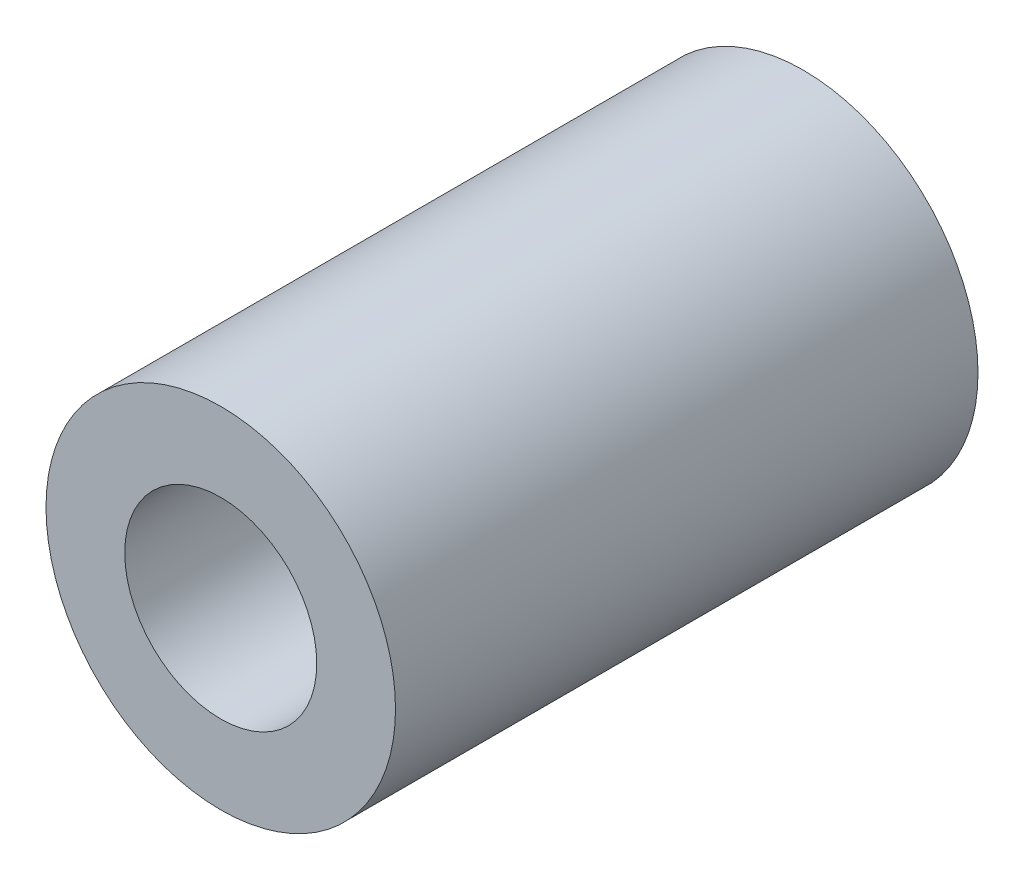
ISO-10303-21;
HEADER;
FILE_DESCRIPTION(('STEP AP214'),'2;1');
FILE_NAME('part.step','',(''),(''),'','','');
FILE_SCHEMA(('AUTOMOTIVE_DESIGN { 1 0 10303 214 1 1 1 1 }'));
ENDSEC;
DATA;
#1=APPLICATION_CONTEXT('core data for automotive mechanical design processes');
#2=APPLICATION_PROTOCOL_DEFINITION('international standard','automotive_design',2000,#1);
#3=PRODUCT_CONTEXT('',#1,'mechanical');
#4=PRODUCT('Part','Part','',(#3));
#5=PRODUCT_RELATED_PRODUCT_CATEGORY('part','',(#4));
#6=PRODUCT_DEFINITION_FORMATION('','',#4);
#7=PRODUCT_DEFINITION_CONTEXT('part definition',#1,'design');
#8=PRODUCT_DEFINITION('design','',#6,#7);
#9=PRODUCT_DEFINITION_SHAPE('','',#8);
#10=(LENGTH_UNIT() NAMED_UNIT(*) SI_UNIT(.MILLI.,.METRE.));
#11=(NAMED_UNIT(*) PLANE_ANGLE_UNIT() SI_UNIT($,.RADIAN.));
#12=(NAMED_UNIT(*) SI_UNIT($,.STERADIAN.) SOLID_ANGLE_UNIT());
#13=UNCERTAINTY_MEASURE_WITH_UNIT(LENGTH_MEASURE(1.E-05),#10,'distance_accuracy_value','');
#14=(GEOMETRIC_REPRESENTATION_CONTEXT(3) GLOBAL_UNCERTAINTY_ASSIGNED_CONTEXT((#13)) GLOBAL_UNIT_ASSIGNED_CONTEXT((#10,
#11,#12)) REPRESENTATION_CONTEXT('',''));
#15=CARTESIAN_POINT('',(0.,0.,0.));
#16=DIRECTION('',(0.,0.,1.));
#17=DIRECTION('',(1.,0.,0.));
#18=AXIS2_PLACEMENT_3D('',#15,#16,#17);
#19=CARTESIAN_POINT('',(0.,0.,15.875));
#20=DIRECTION('',(0.,0.,-1.));
#21=DIRECTION('',(-1.,0.,0.));
#22=AXIS2_PLACEMENT_3D('',#19,#20,#21);
#23=CYLINDRICAL_SURFACE('',#22,4.7625);
#24=CARTESIAN_POINT('',(0.,0.,15.875));
#25=DIRECTION('',(0.,0.,1.));
#26=DIRECTION('',(1.,0.,0.));
#27=AXIS2_PLACEMENT_3D('',#24,#25,#26);
#28=CIRCLE('',#27,4.7625);
#29=CARTESIAN_POINT('',(4.7625,0.,15.875));
#30=VERTEX_POINT('',#29);
#31=EDGE_CURVE('E10',#30,#30,#28,.T.);
#32=ORIENTED_EDGE('',*,*,#31,.F.);
#33=EDGE_LOOP('',(#32));
#34=FACE_BOUND('',#33,.T.);
#35=CARTESIAN_POINT('',(0.,0.,0.));
#36=DIRECTION('',(0.,0.,1.));
#37=DIRECTION('',(1.,0.,0.));
#38=AXIS2_PLACEMENT_3D('',#35,#36,#37);
#39=CIRCLE('',#38,4.7625);
#40=CARTESIAN_POINT('',(4.7625,0.,0.));
#41=VERTEX_POINT('',#40);
#42=EDGE_CURVE('E18',#41,#41,#39,.T.);
#43=ORIENTED_EDGE('',*,*,#42,.T.);
#44=EDGE_LOOP('',(#43));
#45=FACE_BOUND('',#44,.T.);
#46=ADVANCED_FACE('F15',(#34,#45),#23,.T.);
#47=CARTESIAN_POINT('',(0.,0.,15.875));
#48=DIRECTION('',(0.,0.,1.));
#49=DIRECTION('',(1.,0.,0.));
#50=AXIS2_PLACEMENT_3D('',#47,#48,#49);
#51=PLANE('',#50);
#52=CARTESIAN_POINT('',(0.,0.,15.875));
#53=DIRECTION('',(0.,0.,1.));
#54=DIRECTION('',(1.,0.,0.));
#55=AXIS2_PLACEMENT_3D('',#52,#53,#54);
#56=CIRCLE('',#55,2.6162);
#57=CARTESIAN_POINT('',(2.6162,0.,15.875));
#58=VERTEX_POINT('',#57);
#59=EDGE_CURVE('E33',#58,#58,#56,.T.);
#60=ORIENTED_EDGE('',*,*,#59,.F.);
#61=EDGE_LOOP('',(#60));
#62=FACE_BOUND('',#61,.T.);
#63=ORIENTED_EDGE('',*,*,#31,.T.);
#64=EDGE_LOOP('',(#63));
#65=FACE_BOUND('',#64,.T.);
#66=ADVANCED_FACE('F40',(#62,#65),#51,.T.);
#67=CARTESIAN_POINT('',(0.,0.,0.));
#68=DIRECTION('',(0.,0.,1.));
#69=DIRECTION('',(1.,0.,0.));
#70=AXIS2_PLACEMENT_3D('',#67,#68,#69);
#71=PLANE('',#70);
#72=CARTESIAN_POINT('',(0.,0.,0.));
#73=DIRECTION('',(0.,0.,1.));
#74=DIRECTION('',(1.,0.,0.));
#75=AXIS2_PLACEMENT_3D('',#72,#73,#74);
#76=CIRCLE('',#75,2.6162);
#77=CARTESIAN_POINT('',(2.6162,0.,0.));
#78=VERTEX_POINT('',#77);
#79=EDGE_CURVE('E29',#78,#78,#76,.F.);
#80=ORIENTED_EDGE('',*,*,#79,.F.);
#81=EDGE_LOOP('',(#80));
#82=FACE_BOUND('',#81,.T.);
#83=ORIENTED_EDGE('',*,*,#42,.F.);
#84=EDGE_LOOP('',(#83));
#85=FACE_BOUND('',#84,.T.);
#86=ADVANCED_FACE('F42',(#82,#85),#71,.F.);
#87=CARTESIAN_POINT('',(0.,0.,-0.00199999999999853));
#88=DIRECTION('',(0.,0.,1.));
#89=DIRECTION('',(1.,0.,0.));
#90=AXIS2_PLACEMENT_3D('',#87,#88,#89);
#91=CYLINDRICAL_SURFACE('',#90,2.6162);
#92=ORIENTED_EDGE('',*,*,#79,.T.);
#93=EDGE_LOOP('',(#92));
#94=FACE_BOUND('',#93,.T.);
#95=ORIENTED_EDGE('',*,*,#59,.T.);
#96=EDGE_LOOP('',(#95));
#97=FACE_BOUND('',#96,.T.);
#98=ADVANCED_FACE('F38',(#94,#97),#91,.F.);
#99=CLOSED_SHELL('',(#46,#66,#86,#98));
#100=MANIFOLD_SOLID_BREP('B1',#99);
#101=ADVANCED_BREP_SHAPE_REPRESENTATION('',(#18,#100),#14);
#102=SHAPE_DEFINITION_REPRESENTATION(#9,#101);
ENDSEC;
END-ISO-10303-21;
